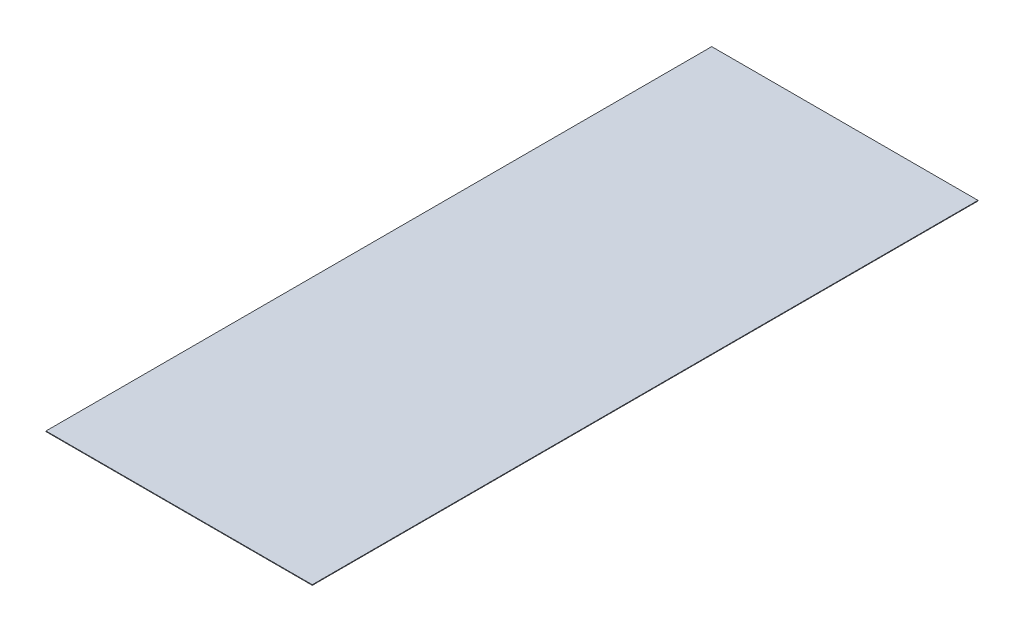
ISO-10303-21;
HEADER;
FILE_DESCRIPTION(('STEP AP214'),'2;1');
FILE_NAME('part.step','',(''),(''),'','','');
FILE_SCHEMA(('AUTOMOTIVE_DESIGN { 1 0 10303 214 1 1 1 1 }'));
ENDSEC;
DATA;
#1=APPLICATION_CONTEXT('core data for automotive mechanical design processes');
#2=APPLICATION_PROTOCOL_DEFINITION('international standard','automotive_design',2000,#1);
#3=PRODUCT_CONTEXT('',#1,'mechanical');
#4=PRODUCT('Part','Part','',(#3));
#5=PRODUCT_RELATED_PRODUCT_CATEGORY('part','',(#4));
#6=PRODUCT_DEFINITION_FORMATION('','',#4);
#7=PRODUCT_DEFINITION_CONTEXT('part definition',#1,'design');
#8=PRODUCT_DEFINITION('design','',#6,#7);
#9=PRODUCT_DEFINITION_SHAPE('','',#8);
#10=(LENGTH_UNIT() NAMED_UNIT(*) SI_UNIT(.MILLI.,.METRE.));
#11=(NAMED_UNIT(*) PLANE_ANGLE_UNIT() SI_UNIT($,.RADIAN.));
#12=(NAMED_UNIT(*) SI_UNIT($,.STERADIAN.) SOLID_ANGLE_UNIT());
#13=UNCERTAINTY_MEASURE_WITH_UNIT(LENGTH_MEASURE(1.E-05),#10,'distance_accuracy_value','');
#14=(GEOMETRIC_REPRESENTATION_CONTEXT(3) GLOBAL_UNCERTAINTY_ASSIGNED_CONTEXT((#13)) GLOBAL_UNIT_ASSIGNED_CONTEXT((#10,
#11,#12)) REPRESENTATION_CONTEXT('',''));
#15=CARTESIAN_POINT('',(0.,0.,0.));
#16=DIRECTION('',(0.,0.,1.));
#17=DIRECTION('',(1.,0.,0.));
#18=AXIS2_PLACEMENT_3D('',#15,#16,#17);
#19=CARTESIAN_POINT('',(609.6,2.7,1524.));
#20=DIRECTION('',(-1.,0.,0.));
#21=DIRECTION('',(0.,0.,1.));
#22=AXIS2_PLACEMENT_3D('',#19,#20,#21);
#23=PLANE('',#22);
#24=DIRECTION('',(0.,0.,-1.));
#25=VECTOR('',#24,1.);
#26=CARTESIAN_POINT('',(609.6,0.,1524.));
#27=LINE('',#26,#25);
#28=CARTESIAN_POINT('',(609.6,0.,1524.));
#29=VERTEX_POINT('',#28);
#30=CARTESIAN_POINT('',(609.6,0.,-1524.));
#31=VERTEX_POINT('',#30);
#32=EDGE_CURVE('E96',#29,#31,#27,.T.);
#33=ORIENTED_EDGE('',*,*,#32,.T.);
#34=DIRECTION('',(0.,-1.,0.));
#35=VECTOR('',#34,1.);
#36=CARTESIAN_POINT('',(609.6,2.7,-1524.));
#37=LINE('',#36,#35);
#38=CARTESIAN_POINT('',(609.6,2.7,-1524.));
#39=VERTEX_POINT('',#38);
#40=EDGE_CURVE('E11',#39,#31,#37,.T.);
#41=ORIENTED_EDGE('',*,*,#40,.F.);
#42=DIRECTION('',(0.,0.,-1.));
#43=VECTOR('',#42,1.);
#44=CARTESIAN_POINT('',(609.6,2.7,1524.));
#45=LINE('',#44,#43);
#46=CARTESIAN_POINT('',(609.6,2.7,1524.));
#47=VERTEX_POINT('',#46);
#48=EDGE_CURVE('E84',#47,#39,#45,.T.);
#49=ORIENTED_EDGE('',*,*,#48,.F.);
#50=DIRECTION('',(0.,-1.,0.));
#51=VECTOR('',#50,1.);
#52=CARTESIAN_POINT('',(609.6,2.7,1524.));
#53=LINE('',#52,#51);
#54=EDGE_CURVE('E92',#47,#29,#53,.T.);
#55=ORIENTED_EDGE('',*,*,#54,.T.);
#56=EDGE_LOOP('',(#33,#41,#49,#55));
#57=FACE_BOUND('',#56,.T.);
#58=ADVANCED_FACE('F33',(#57),#23,.F.);
#59=CARTESIAN_POINT('',(-609.6,2.7,-1524.));
#60=DIRECTION('',(0.,0.,1.));
#61=DIRECTION('',(1.,0.,0.));
#62=AXIS2_PLACEMENT_3D('',#59,#60,#61);
#63=PLANE('',#62);
#64=DIRECTION('',(-1.,0.,0.));
#65=VECTOR('',#64,1.);
#66=CARTESIAN_POINT('',(-609.6,0.,-1524.));
#67=LINE('',#66,#65);
#68=CARTESIAN_POINT('',(-609.6,0.,-1524.));
#69=VERTEX_POINT('',#68);
#70=EDGE_CURVE('E88',#31,#69,#67,.T.);
#71=ORIENTED_EDGE('',*,*,#70,.T.);
#72=DIRECTION('',(0.,-1.,0.));
#73=VECTOR('',#72,1.);
#74=CARTESIAN_POINT('',(-609.6,2.7,-1524.));
#75=LINE('',#74,#73);
#76=CARTESIAN_POINT('',(-609.6,2.7,-1524.));
#77=VERTEX_POINT('',#76);
#78=EDGE_CURVE('E41',#77,#69,#75,.T.);
#79=ORIENTED_EDGE('',*,*,#78,.F.);
#80=DIRECTION('',(-1.,0.,0.));
#81=VECTOR('',#80,1.);
#82=CARTESIAN_POINT('',(-609.6,2.7,-1524.));
#83=LINE('',#82,#81);
#84=EDGE_CURVE('E79',#39,#77,#83,.T.);
#85=ORIENTED_EDGE('',*,*,#84,.F.);
#86=ORIENTED_EDGE('',*,*,#40,.T.);
#87=EDGE_LOOP('',(#71,#79,#85,#86));
#88=FACE_BOUND('',#87,.T.);
#89=ADVANCED_FACE('F87',(#88),#63,.F.);
#90=CARTESIAN_POINT('',(-609.6,2.7,1524.));
#91=DIRECTION('',(1.,0.,0.));
#92=DIRECTION('',(0.,0.,-1.));
#93=AXIS2_PLACEMENT_3D('',#90,#91,#92);
#94=PLANE('',#93);
#95=DIRECTION('',(0.,0.,1.));
#96=VECTOR('',#95,1.);
#97=CARTESIAN_POINT('',(-609.6,0.,1524.));
#98=LINE('',#97,#96);
#99=CARTESIAN_POINT('',(-609.6,0.,1524.));
#100=VERTEX_POINT('',#99);
#101=EDGE_CURVE('E66',#69,#100,#98,.T.);
#102=ORIENTED_EDGE('',*,*,#101,.T.);
#103=DIRECTION('',(0.,-1.,0.));
#104=VECTOR('',#103,1.);
#105=CARTESIAN_POINT('',(-609.6,2.7,1524.));
#106=LINE('',#105,#104);
#107=CARTESIAN_POINT('',(-609.6,2.7,1524.));
#108=VERTEX_POINT('',#107);
#109=EDGE_CURVE('E89',#108,#100,#106,.T.);
#110=ORIENTED_EDGE('',*,*,#109,.F.);
#111=DIRECTION('',(0.,0.,1.));
#112=VECTOR('',#111,1.);
#113=CARTESIAN_POINT('',(-609.6,2.7,1524.));
#114=LINE('',#113,#112);
#115=EDGE_CURVE('E82',#77,#108,#114,.T.);
#116=ORIENTED_EDGE('',*,*,#115,.F.);
#117=ORIENTED_EDGE('',*,*,#78,.T.);
#118=EDGE_LOOP('',(#102,#110,#116,#117));
#119=FACE_BOUND('',#118,.T.);
#120=ADVANCED_FACE('F90',(#119),#94,.F.);
#121=CARTESIAN_POINT('',(-609.6,2.7,1524.));
#122=DIRECTION('',(0.,0.,-1.));
#123=DIRECTION('',(-1.,0.,0.));
#124=AXIS2_PLACEMENT_3D('',#121,#122,#123);
#125=PLANE('',#124);
#126=DIRECTION('',(1.,0.,0.));
#127=VECTOR('',#126,1.);
#128=CARTESIAN_POINT('',(-609.6,0.,1524.));
#129=LINE('',#128,#127);
#130=EDGE_CURVE('E72',#100,#29,#129,.T.);
#131=ORIENTED_EDGE('',*,*,#130,.T.);
#132=ORIENTED_EDGE('',*,*,#54,.F.);
#133=DIRECTION('',(1.,0.,0.));
#134=VECTOR('',#133,1.);
#135=CARTESIAN_POINT('',(-609.6,2.7,1524.));
#136=LINE('',#135,#134);
#137=EDGE_CURVE('E49',#108,#47,#136,.T.);
#138=ORIENTED_EDGE('',*,*,#137,.F.);
#139=ORIENTED_EDGE('',*,*,#109,.T.);
#140=EDGE_LOOP('',(#131,#132,#138,#139));
#141=FACE_BOUND('',#140,.T.);
#142=ADVANCED_FACE('F103',(#141),#125,.F.);
#143=CARTESIAN_POINT('',(0.,2.7,0.));
#144=DIRECTION('',(0.,-1.,0.));
#145=DIRECTION('',(0.,0.,-1.));
#146=AXIS2_PLACEMENT_3D('',#143,#144,#145);
#147=PLANE('',#146);
#148=ORIENTED_EDGE('',*,*,#48,.T.);
#149=ORIENTED_EDGE('',*,*,#84,.T.);
#150=ORIENTED_EDGE('',*,*,#115,.T.);
#151=ORIENTED_EDGE('',*,*,#137,.T.);
#152=EDGE_LOOP('',(#148,#149,#150,#151));
#153=FACE_BOUND('',#152,.T.);
#154=ADVANCED_FACE('F80',(#153),#147,.F.);
#155=CARTESIAN_POINT('',(0.,0.,0.));
#156=DIRECTION('',(0.,-1.,0.));
#157=DIRECTION('',(0.,0.,-1.));
#158=AXIS2_PLACEMENT_3D('',#155,#156,#157);
#159=PLANE('',#158);
#160=ORIENTED_EDGE('',*,*,#32,.F.);
#161=ORIENTED_EDGE('',*,*,#130,.F.);
#162=ORIENTED_EDGE('',*,*,#101,.F.);
#163=ORIENTED_EDGE('',*,*,#70,.F.);
#164=EDGE_LOOP('',(#160,#161,#162,#163));
#165=FACE_BOUND('',#164,.T.);
#166=ADVANCED_FACE('F106',(#165),#159,.T.);
#167=CLOSED_SHELL('',(#58,#89,#120,#142,#154,#166));
#168=MANIFOLD_SOLID_BREP('B2',#167);
#169=ADVANCED_BREP_SHAPE_REPRESENTATION('',(#18,#168),#14);
#170=SHAPE_DEFINITION_REPRESENTATION(#9,#169);
ENDSEC;
END-ISO-10303-21;
